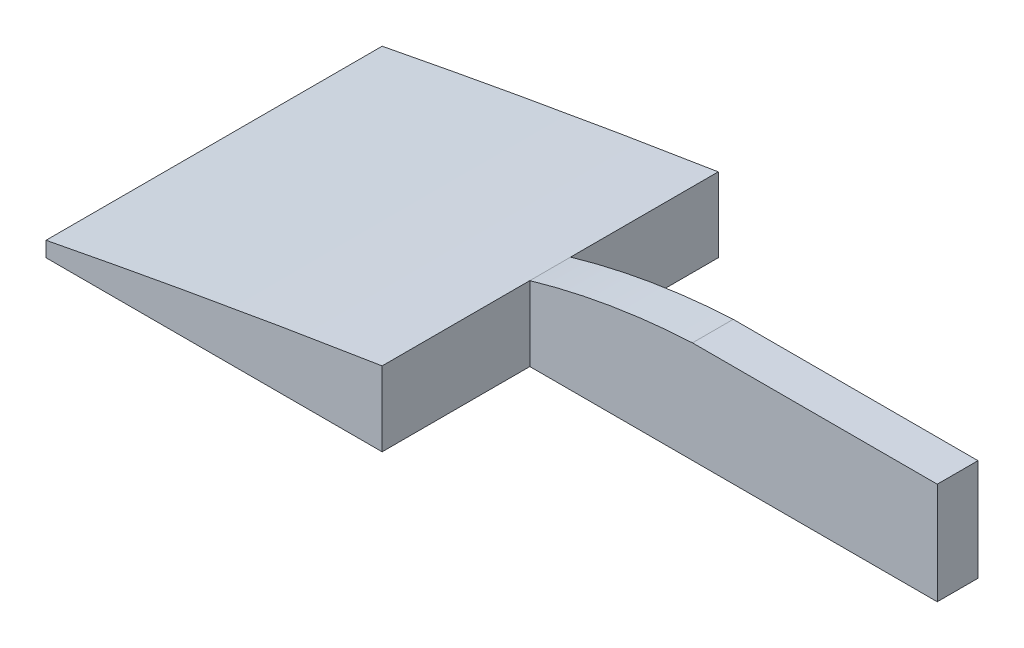
ISO-10303-21;
HEADER;
FILE_DESCRIPTION(('STEP AP214'),'2;1');
FILE_NAME('part.step','',(''),(''),'','','');
FILE_SCHEMA(('AUTOMOTIVE_DESIGN { 1 0 10303 214 1 1 1 1 }'));
ENDSEC;
DATA;
#1=APPLICATION_CONTEXT('core data for automotive mechanical design processes');
#2=APPLICATION_PROTOCOL_DEFINITION('international standard','automotive_design',2000,#1);
#3=PRODUCT_CONTEXT('',#1,'mechanical');
#4=PRODUCT('Part','Part','',(#3));
#5=PRODUCT_RELATED_PRODUCT_CATEGORY('part','',(#4));
#6=PRODUCT_DEFINITION_FORMATION('','',#4);
#7=PRODUCT_DEFINITION_CONTEXT('part definition',#1,'design');
#8=PRODUCT_DEFINITION('design','',#6,#7);
#9=PRODUCT_DEFINITION_SHAPE('','',#8);
#10=(LENGTH_UNIT() NAMED_UNIT(*) SI_UNIT(.MILLI.,.METRE.));
#11=(NAMED_UNIT(*) PLANE_ANGLE_UNIT() SI_UNIT($,.RADIAN.));
#12=(NAMED_UNIT(*) SI_UNIT($,.STERADIAN.) SOLID_ANGLE_UNIT());
#13=UNCERTAINTY_MEASURE_WITH_UNIT(LENGTH_MEASURE(1.E-05),#10,'distance_accuracy_value','');
#14=(GEOMETRIC_REPRESENTATION_CONTEXT(3) GLOBAL_UNCERTAINTY_ASSIGNED_CONTEXT((#13)) GLOBAL_UNIT_ASSIGNED_CONTEXT((#10,
#11,#12)) REPRESENTATION_CONTEXT('',''));
#15=CARTESIAN_POINT('',(0.,0.,0.));
#16=DIRECTION('',(0.,0.,1.));
#17=DIRECTION('',(1.,0.,0.));
#18=AXIS2_PLACEMENT_3D('',#15,#16,#17);
#19=CARTESIAN_POINT('',(-16.5,5.,7.25));
#20=DIRECTION('',(-1.,0.,0.));
#21=DIRECTION('',(0.,0.,1.));
#22=AXIS2_PLACEMENT_3D('',#19,#20,#21);
#23=PLANE('',#22);
#24=DIRECTION('',(0.,0.,-1.));
#25=VECTOR('',#24,1.);
#26=CARTESIAN_POINT('',(-16.5,0.744396354782328,7.75));
#27=LINE('',#26,#25);
#28=CARTESIAN_POINT('',(-16.5,0.744396354782328,7.25));
#29=VERTEX_POINT('',#28);
#30=CARTESIAN_POINT('',(-16.5,0.744396354782328,-9.25));
#31=VERTEX_POINT('',#30);
#32=EDGE_CURVE('E107',#29,#31,#27,.T.);
#33=ORIENTED_EDGE('',*,*,#32,.T.);
#34=DIRECTION('',(0.,-1.,0.));
#35=VECTOR('',#34,1.);
#36=CARTESIAN_POINT('',(-16.5,5.,-9.25));
#37=LINE('',#36,#35);
#38=CARTESIAN_POINT('',(-16.5,0.,-9.25));
#39=VERTEX_POINT('',#38);
#40=EDGE_CURVE('E163',#31,#39,#37,.T.);
#41=ORIENTED_EDGE('',*,*,#40,.T.);
#42=DIRECTION('',(0.,0.,-1.));
#43=VECTOR('',#42,1.);
#44=CARTESIAN_POINT('',(-16.5,0.,7.25));
#45=LINE('',#44,#43);
#46=CARTESIAN_POINT('',(-16.5,0.,7.25));
#47=VERTEX_POINT('',#46);
#48=EDGE_CURVE('E147',#47,#39,#45,.T.);
#49=ORIENTED_EDGE('',*,*,#48,.F.);
#50=DIRECTION('',(0.,-1.,0.));
#51=VECTOR('',#50,1.);
#52=CARTESIAN_POINT('',(-16.5,5.,7.25));
#53=LINE('',#52,#51);
#54=EDGE_CURVE('E161',#29,#47,#53,.T.);
#55=ORIENTED_EDGE('',*,*,#54,.F.);
#56=EDGE_LOOP('',(#33,#41,#49,#55));
#57=FACE_BOUND('',#56,.T.);
#58=ADVANCED_FACE('F63',(#57),#23,.T.);
#59=CARTESIAN_POINT('',(0.,5.,7.25));
#60=DIRECTION('',(0.,0.,1.));
#61=DIRECTION('',(1.,0.,0.));
#62=AXIS2_PLACEMENT_3D('',#59,#60,#61);
#63=PLANE('',#62);
#64=CARTESIAN_POINT('',(0.,3.65406697178638,7.25));
#65=CARTESIAN_POINT('',(-8.27628737548007,2.34700632683638,7.25));
#66=CARTESIAN_POINT('',(-16.5,0.744396354782328,7.25));
#67=B_SPLINE_CURVE_WITH_KNOTS('',2,(#64,#65,#66),.UNSPECIFIED.,.F.,.F.,(3,3),(0.,1.),.UNSPECIFIED.);
#68=CARTESIAN_POINT('',(0.,3.65406697178638,7.25));
#69=VERTEX_POINT('',#68);
#70=EDGE_CURVE('E153',#29,#69,#67,.F.);
#71=ORIENTED_EDGE('',*,*,#70,.F.);
#72=ORIENTED_EDGE('',*,*,#54,.T.);
#73=DIRECTION('',(-1.,0.,0.));
#74=VECTOR('',#73,1.);
#75=CARTESIAN_POINT('',(0.,0.,7.25));
#76=LINE('',#75,#74);
#77=CARTESIAN_POINT('',(0.,0.,7.25));
#78=VERTEX_POINT('',#77);
#79=EDGE_CURVE('E142',#78,#47,#76,.T.);
#80=ORIENTED_EDGE('',*,*,#79,.F.);
#81=DIRECTION('',(0.,-1.,0.));
#82=VECTOR('',#81,1.);
#83=CARTESIAN_POINT('',(0.,5.,7.25));
#84=LINE('',#83,#82);
#85=EDGE_CURVE('E134',#69,#78,#84,.T.);
#86=ORIENTED_EDGE('',*,*,#85,.F.);
#87=EDGE_LOOP('',(#71,#72,#80,#86));
#88=FACE_BOUND('',#87,.T.);
#89=ADVANCED_FACE('F226',(#88),#63,.T.);
#90=CARTESIAN_POINT('',(0.,5.,-9.25));
#91=DIRECTION('',(0.,0.,1.));
#92=DIRECTION('',(1.,0.,0.));
#93=AXIS2_PLACEMENT_3D('',#90,#91,#92);
#94=PLANE('',#93);
#95=ORIENTED_EDGE('',*,*,#40,.F.);
#96=CARTESIAN_POINT('',(0.,3.65406697178638,-9.25));
#97=CARTESIAN_POINT('',(-8.27628737548007,2.34700632683638,-9.25));
#98=CARTESIAN_POINT('',(-16.5,0.744396354782328,-9.25));
#99=B_SPLINE_CURVE_WITH_KNOTS('',2,(#96,#97,#98),.UNSPECIFIED.,.F.,.F.,(3,3),(0.,1.),.UNSPECIFIED.);
#100=CARTESIAN_POINT('',(0.,3.65406697178638,-9.25));
#101=VERTEX_POINT('',#100);
#102=EDGE_CURVE('E133',#101,#31,#99,.T.);
#103=ORIENTED_EDGE('',*,*,#102,.F.);
#104=DIRECTION('',(0.,-1.,0.));
#105=VECTOR('',#104,1.);
#106=CARTESIAN_POINT('',(0.,5.,-9.25));
#107=LINE('',#106,#105);
#108=CARTESIAN_POINT('',(0.,0.,-9.25));
#109=VERTEX_POINT('',#108);
#110=EDGE_CURVE('E126',#101,#109,#107,.T.);
#111=ORIENTED_EDGE('',*,*,#110,.T.);
#112=DIRECTION('',(-1.,0.,0.));
#113=VECTOR('',#112,1.);
#114=CARTESIAN_POINT('',(0.,0.,-9.25));
#115=LINE('',#114,#113);
#116=EDGE_CURVE('E130',#109,#39,#115,.T.);
#117=ORIENTED_EDGE('',*,*,#116,.T.);
#118=EDGE_LOOP('',(#95,#103,#111,#117));
#119=FACE_BOUND('',#118,.T.);
#120=ADVANCED_FACE('F128',(#119),#94,.F.);
#121=CARTESIAN_POINT('',(0.,0.,0.));
#122=DIRECTION('',(0.,-1.,0.));
#123=DIRECTION('',(0.,0.,-1.));
#124=AXIS2_PLACEMENT_3D('',#121,#122,#123);
#125=PLANE('',#124);
#126=ORIENTED_EDGE('',*,*,#116,.F.);
#127=DIRECTION('',(0.,0.,-1.));
#128=VECTOR('',#127,1.);
#129=CARTESIAN_POINT('',(0.,0.,7.25));
#130=LINE('',#129,#128);
#131=CARTESIAN_POINT('',(0.,0.,-2.));
#132=VERTEX_POINT('',#131);
#133=EDGE_CURVE('E138',#132,#109,#130,.T.);
#134=ORIENTED_EDGE('',*,*,#133,.F.);
#135=DIRECTION('',(1.,0.,0.));
#136=VECTOR('',#135,1.);
#137=CARTESIAN_POINT('',(0.,0.,-2.));
#138=LINE('',#137,#136);
#139=CARTESIAN_POINT('',(20.,0.,-2.));
#140=VERTEX_POINT('',#139);
#141=EDGE_CURVE('E173',#132,#140,#138,.T.);
#142=ORIENTED_EDGE('',*,*,#141,.T.);
#143=DIRECTION('',(0.,0.,-1.));
#144=VECTOR('',#143,1.);
#145=CARTESIAN_POINT('',(20.,0.,0.));
#146=LINE('',#145,#144);
#147=CARTESIAN_POINT('',(20.,0.,0.));
#148=VERTEX_POINT('',#147);
#149=EDGE_CURVE('E175',#148,#140,#146,.T.);
#150=ORIENTED_EDGE('',*,*,#149,.F.);
#151=DIRECTION('',(1.,0.,0.));
#152=VECTOR('',#151,1.);
#153=CARTESIAN_POINT('',(0.,0.,0.));
#154=LINE('',#153,#152);
#155=CARTESIAN_POINT('',(0.,0.,0.));
#156=VERTEX_POINT('',#155);
#157=EDGE_CURVE('E168',#156,#148,#154,.T.);
#158=ORIENTED_EDGE('',*,*,#157,.F.);
#159=EDGE_CURVE('E135',#78,#156,#130,.T.);
#160=ORIENTED_EDGE('',*,*,#159,.F.);
#161=ORIENTED_EDGE('',*,*,#79,.T.);
#162=ORIENTED_EDGE('',*,*,#48,.T.);
#163=EDGE_LOOP('',(#126,#134,#142,#150,#158,#160,#161,#162));
#164=FACE_BOUND('',#163,.T.);
#165=ADVANCED_FACE('F144',(#164),#125,.T.);
#166=CARTESIAN_POINT('',(0.,5.,0.));
#167=DIRECTION('',(0.,-1.,0.));
#168=DIRECTION('',(0.,0.,-1.));
#169=AXIS2_PLACEMENT_3D('',#166,#167,#168);
#170=PLANE('',#169);
#171=DIRECTION('',(1.,0.,0.));
#172=VECTOR('',#171,1.);
#173=CARTESIAN_POINT('',(0.,5.,-2.));
#174=LINE('',#173,#172);
#175=CARTESIAN_POINT('',(7.98359952117273,5.,-2.));
#176=VERTEX_POINT('',#175);
#177=CARTESIAN_POINT('',(20.,5.,-2.));
#178=VERTEX_POINT('',#177);
#179=EDGE_CURVE('E165',#176,#178,#174,.T.);
#180=ORIENTED_EDGE('',*,*,#179,.F.);
#181=DIRECTION('',(0.,0.,1.));
#182=VECTOR('',#181,1.);
#183=CARTESIAN_POINT('',(7.98359952117273,5.,-17.));
#184=LINE('',#183,#182);
#185=CARTESIAN_POINT('',(7.98359952117273,5.,0.));
#186=VERTEX_POINT('',#185);
#187=EDGE_CURVE('E200',#176,#186,#184,.T.);
#188=ORIENTED_EDGE('',*,*,#187,.T.);
#189=DIRECTION('',(1.,0.,0.));
#190=VECTOR('',#189,1.);
#191=CARTESIAN_POINT('',(0.,5.,0.));
#192=LINE('',#191,#190);
#193=CARTESIAN_POINT('',(20.,5.,0.));
#194=VERTEX_POINT('',#193);
#195=EDGE_CURVE('E171',#186,#194,#192,.T.);
#196=ORIENTED_EDGE('',*,*,#195,.T.);
#197=DIRECTION('',(0.,0.,-1.));
#198=VECTOR('',#197,1.);
#199=CARTESIAN_POINT('',(20.,5.,0.));
#200=LINE('',#199,#198);
#201=EDGE_CURVE('E167',#194,#178,#200,.T.);
#202=ORIENTED_EDGE('',*,*,#201,.T.);
#203=EDGE_LOOP('',(#180,#188,#196,#202));
#204=FACE_BOUND('',#203,.T.);
#205=ADVANCED_FACE('F204',(#204),#170,.F.);
#206=CARTESIAN_POINT('',(0.,5.,7.25));
#207=DIRECTION('',(-1.,0.,0.));
#208=DIRECTION('',(0.,0.,1.));
#209=AXIS2_PLACEMENT_3D('',#206,#207,#208);
#210=PLANE('',#209);
#211=ORIENTED_EDGE('',*,*,#110,.F.);
#212=DIRECTION('',(0.,0.,-1.));
#213=VECTOR('',#212,1.);
#214=CARTESIAN_POINT('',(0.,3.65406697178638,7.75000000000001));
#215=LINE('',#214,#213);
#216=CARTESIAN_POINT('',(0.,3.65406697178638,-2.));
#217=VERTEX_POINT('',#216);
#218=EDGE_CURVE('E224',#217,#101,#215,.T.);
#219=ORIENTED_EDGE('',*,*,#218,.F.);
#220=DIRECTION('',(0.,-1.,0.));
#221=VECTOR('',#220,1.);
#222=CARTESIAN_POINT('',(0.,5.,-2.));
#223=LINE('',#222,#221);
#224=EDGE_CURVE('E73',#217,#132,#223,.T.);
#225=ORIENTED_EDGE('',*,*,#224,.T.);
#226=ORIENTED_EDGE('',*,*,#133,.T.);
#227=EDGE_LOOP('',(#211,#219,#225,#226));
#228=FACE_BOUND('',#227,.T.);
#229=ADVANCED_FACE('F139',(#228),#210,.F.);
#230=DIRECTION('',(0.,-1.,0.));
#231=VECTOR('',#230,1.);
#232=CARTESIAN_POINT('',(0.,5.,0.));
#233=LINE('',#232,#231);
#234=CARTESIAN_POINT('',(0.,3.65406697178638,0.));
#235=VERTEX_POINT('',#234);
#236=EDGE_CURVE('E12',#235,#156,#233,.T.);
#237=ORIENTED_EDGE('',*,*,#236,.F.);
#238=EDGE_CURVE('E217',#69,#235,#215,.T.);
#239=ORIENTED_EDGE('',*,*,#238,.F.);
#240=ORIENTED_EDGE('',*,*,#85,.T.);
#241=ORIENTED_EDGE('',*,*,#159,.T.);
#242=EDGE_LOOP('',(#237,#239,#240,#241));
#243=FACE_BOUND('',#242,.T.);
#244=ADVANCED_FACE('F222',(#243),#210,.F.);
#245=CARTESIAN_POINT('',(20.,5.,0.));
#246=DIRECTION('',(-1.,0.,0.));
#247=DIRECTION('',(0.,0.,1.));
#248=AXIS2_PLACEMENT_3D('',#245,#246,#247);
#249=PLANE('',#248);
#250=ORIENTED_EDGE('',*,*,#149,.T.);
#251=DIRECTION('',(0.,-1.,0.));
#252=VECTOR('',#251,1.);
#253=CARTESIAN_POINT('',(20.,5.,-2.));
#254=LINE('',#253,#252);
#255=EDGE_CURVE('E67',#178,#140,#254,.T.);
#256=ORIENTED_EDGE('',*,*,#255,.F.);
#257=ORIENTED_EDGE('',*,*,#201,.F.);
#258=DIRECTION('',(0.,-1.,0.));
#259=VECTOR('',#258,1.);
#260=CARTESIAN_POINT('',(20.,5.,0.));
#261=LINE('',#260,#259);
#262=EDGE_CURVE('E148',#194,#148,#261,.T.);
#263=ORIENTED_EDGE('',*,*,#262,.T.);
#264=EDGE_LOOP('',(#250,#256,#257,#263));
#265=FACE_BOUND('',#264,.T.);
#266=ADVANCED_FACE('F189',(#265),#249,.F.);
#267=CARTESIAN_POINT('',(0.,5.,-2.));
#268=DIRECTION('',(0.,0.,-1.));
#269=DIRECTION('',(-1.,0.,0.));
#270=AXIS2_PLACEMENT_3D('',#267,#268,#269);
#271=PLANE('',#270);
#272=CARTESIAN_POINT('',(0.,3.65406697178638,-2.));
#273=CARTESIAN_POINT('',(3.90789352476644,4.79303397449833,-2.));
#274=CARTESIAN_POINT('',(7.98359952117273,5.,-2.));
#275=B_SPLINE_CURVE_WITH_KNOTS('',2,(#272,#273,#274),.UNSPECIFIED.,.F.,.F.,(3,3),(0.,1.),.UNSPECIFIED.);
#276=EDGE_CURVE('E192',#176,#217,#275,.F.);
#277=ORIENTED_EDGE('',*,*,#276,.F.);
#278=ORIENTED_EDGE('',*,*,#179,.T.);
#279=ORIENTED_EDGE('',*,*,#255,.T.);
#280=ORIENTED_EDGE('',*,*,#141,.F.);
#281=ORIENTED_EDGE('',*,*,#224,.F.);
#282=EDGE_LOOP('',(#277,#278,#279,#280,#281));
#283=FACE_BOUND('',#282,.T.);
#284=ADVANCED_FACE('F65',(#283),#271,.T.);
#285=CARTESIAN_POINT('',(0.,5.,0.));
#286=DIRECTION('',(0.,0.,-1.));
#287=DIRECTION('',(-1.,0.,0.));
#288=AXIS2_PLACEMENT_3D('',#285,#286,#287);
#289=PLANE('',#288);
#290=ORIENTED_EDGE('',*,*,#195,.F.);
#291=CARTESIAN_POINT('',(0.,3.65406697178638,0.));
#292=CARTESIAN_POINT('',(3.90789352476644,4.79303397449833,0.));
#293=CARTESIAN_POINT('',(7.98359952117273,5.,0.));
#294=B_SPLINE_CURVE_WITH_KNOTS('',2,(#291,#292,#293),.UNSPECIFIED.,.F.,.F.,(3,3),(0.,1.),.UNSPECIFIED.);
#295=EDGE_CURVE('E207',#235,#186,#294,.T.);
#296=ORIENTED_EDGE('',*,*,#295,.F.);
#297=ORIENTED_EDGE('',*,*,#236,.T.);
#298=ORIENTED_EDGE('',*,*,#157,.T.);
#299=ORIENTED_EDGE('',*,*,#262,.F.);
#300=EDGE_LOOP('',(#290,#296,#297,#298,#299));
#301=FACE_BOUND('',#300,.T.);
#302=ADVANCED_FACE('F182',(#301),#289,.F.);
#303=CARTESIAN_POINT('',(0.,3.65406697178638,7.75000000000001));
#304=CARTESIAN_POINT('',(-8.27628737548007,2.34700632683638,7.75));
#305=CARTESIAN_POINT('',(-16.5,0.744396354782328,7.75));
#306=B_SPLINE_CURVE_WITH_KNOTS('',2,(#303,#304,#305),.UNSPECIFIED.,.F.,.F.,(3,3),(0.,1.),.UNSPECIFIED.);
#307=DIRECTION('',(0.,0.,-1.));
#308=VECTOR('',#307,1.);
#309=SURFACE_OF_LINEAR_EXTRUSION('',#306,#308);
#310=ORIENTED_EDGE('',*,*,#70,.T.);
#311=ORIENTED_EDGE('',*,*,#238,.T.);
#312=EDGE_CURVE('E223',#235,#217,#215,.T.);
#313=ORIENTED_EDGE('',*,*,#312,.T.);
#314=ORIENTED_EDGE('',*,*,#218,.T.);
#315=ORIENTED_EDGE('',*,*,#102,.T.);
#316=ORIENTED_EDGE('',*,*,#32,.F.);
#317=EDGE_LOOP('',(#310,#311,#313,#314,#315,#316));
#318=FACE_BOUND('',#317,.T.);
#319=ADVANCED_FACE('F216',(#318),#309,.F.);
#320=CARTESIAN_POINT('',(0.,3.65406697178638,-17.));
#321=CARTESIAN_POINT('',(3.90789352476644,4.79303397449833,-17.));
#322=CARTESIAN_POINT('',(7.98359952117273,5.,-17.));
#323=B_SPLINE_CURVE_WITH_KNOTS('',2,(#320,#321,#322),.UNSPECIFIED.,.F.,.F.,(3,3),(0.,1.),.UNSPECIFIED.);
#324=DIRECTION('',(0.,0.,1.));
#325=VECTOR('',#324,1.);
#326=SURFACE_OF_LINEAR_EXTRUSION('',#323,#325);
#327=ORIENTED_EDGE('',*,*,#276,.T.);
#328=ORIENTED_EDGE('',*,*,#312,.F.);
#329=ORIENTED_EDGE('',*,*,#295,.T.);
#330=ORIENTED_EDGE('',*,*,#187,.F.);
#331=EDGE_LOOP('',(#327,#328,#329,#330));
#332=FACE_BOUND('',#331,.T.);
#333=ADVANCED_FACE('F233',(#332),#326,.F.);
#334=CLOSED_SHELL('',(#58,#89,#120,#165,#205,#229,#244,#266,#284,#302,#319,#333));
#335=MANIFOLD_SOLID_BREP('B2',#334);
#336=ADVANCED_BREP_SHAPE_REPRESENTATION('',(#18,#335),#14);
#337=SHAPE_DEFINITION_REPRESENTATION(#9,#336);
ENDSEC;
END-ISO-10303-21;
